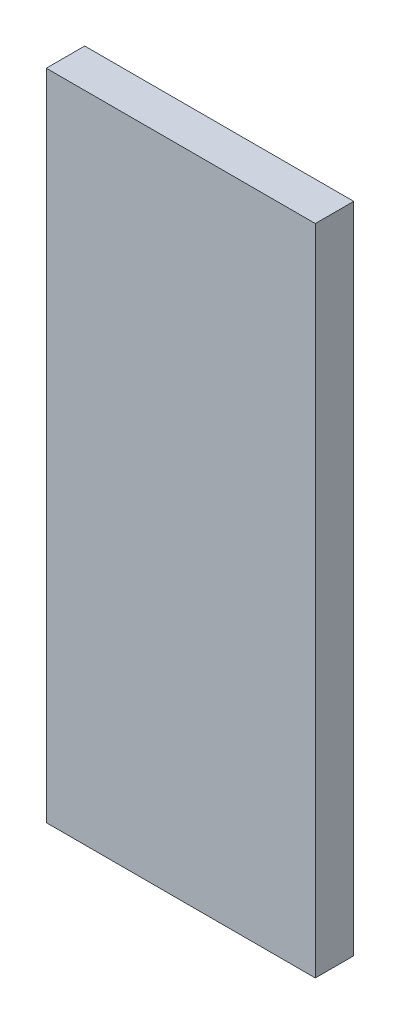
ISO-10303-21;
HEADER;
FILE_DESCRIPTION(('STEP AP214'),'2;1');
FILE_NAME('part.step','',(''),(''),'','','');
FILE_SCHEMA(('AUTOMOTIVE_DESIGN { 1 0 10303 214 1 1 1 1 }'));
ENDSEC;
DATA;
#1=APPLICATION_CONTEXT('core data for automotive mechanical design processes');
#2=APPLICATION_PROTOCOL_DEFINITION('international standard','automotive_design',2000,#1);
#3=PRODUCT_CONTEXT('',#1,'mechanical');
#4=PRODUCT('Part','Part','',(#3));
#5=PRODUCT_RELATED_PRODUCT_CATEGORY('part','',(#4));
#6=PRODUCT_DEFINITION_FORMATION('','',#4);
#7=PRODUCT_DEFINITION_CONTEXT('part definition',#1,'design');
#8=PRODUCT_DEFINITION('design','',#6,#7);
#9=PRODUCT_DEFINITION_SHAPE('','',#8);
#10=(LENGTH_UNIT() NAMED_UNIT(*) SI_UNIT(.MILLI.,.METRE.));
#11=(NAMED_UNIT(*) PLANE_ANGLE_UNIT() SI_UNIT($,.RADIAN.));
#12=(NAMED_UNIT(*) SI_UNIT($,.STERADIAN.) SOLID_ANGLE_UNIT());
#13=UNCERTAINTY_MEASURE_WITH_UNIT(LENGTH_MEASURE(1.E-05),#10,'distance_accuracy_value','');
#14=(GEOMETRIC_REPRESENTATION_CONTEXT(3) GLOBAL_UNCERTAINTY_ASSIGNED_CONTEXT((#13)) GLOBAL_UNIT_ASSIGNED_CONTEXT((#10,
#11,#12)) REPRESENTATION_CONTEXT('',''));
#15=CARTESIAN_POINT('',(0.,0.,0.));
#16=DIRECTION('',(0.,0.,1.));
#17=DIRECTION('',(1.,0.,0.));
#18=AXIS2_PLACEMENT_3D('',#15,#16,#17);
#19=CARTESIAN_POINT('',(0.,0.,50.));
#20=DIRECTION('',(1.,0.,0.));
#21=DIRECTION('',(0.,0.,-1.));
#22=AXIS2_PLACEMENT_3D('',#19,#20,#21);
#23=PLANE('',#22);
#24=DIRECTION('',(0.,-1.,0.));
#25=VECTOR('',#24,1.);
#26=CARTESIAN_POINT('',(0.,0.,0.));
#27=LINE('',#26,#25);
#28=CARTESIAN_POINT('',(0.,850.,0.));
#29=VERTEX_POINT('',#28);
#30=CARTESIAN_POINT('',(0.,0.,0.));
#31=VERTEX_POINT('',#30);
#32=EDGE_CURVE('E106',#29,#31,#27,.T.);
#33=ORIENTED_EDGE('',*,*,#32,.T.);
#34=DIRECTION('',(0.,0.,-1.));
#35=VECTOR('',#34,1.);
#36=CARTESIAN_POINT('',(0.,0.,50.));
#37=LINE('',#36,#35);
#38=CARTESIAN_POINT('',(0.,0.,50.));
#39=VERTEX_POINT('',#38);
#40=EDGE_CURVE('E11',#39,#31,#37,.T.);
#41=ORIENTED_EDGE('',*,*,#40,.F.);
#42=DIRECTION('',(0.,-1.,0.));
#43=VECTOR('',#42,1.);
#44=CARTESIAN_POINT('',(0.,0.,50.));
#45=LINE('',#44,#43);
#46=CARTESIAN_POINT('',(0.,850.,50.));
#47=VERTEX_POINT('',#46);
#48=EDGE_CURVE('E92',#47,#39,#45,.T.);
#49=ORIENTED_EDGE('',*,*,#48,.F.);
#50=DIRECTION('',(0.,0.,-1.));
#51=VECTOR('',#50,1.);
#52=CARTESIAN_POINT('',(0.,850.,50.));
#53=LINE('',#52,#51);
#54=EDGE_CURVE('E105',#47,#29,#53,.T.);
#55=ORIENTED_EDGE('',*,*,#54,.T.);
#56=EDGE_LOOP('',(#33,#41,#49,#55));
#57=FACE_BOUND('',#56,.T.);
#58=ADVANCED_FACE('F43',(#57),#23,.F.);
#59=CARTESIAN_POINT('',(0.,0.,50.));
#60=DIRECTION('',(0.,1.,0.));
#61=DIRECTION('',(0.,0.,1.));
#62=AXIS2_PLACEMENT_3D('',#59,#60,#61);
#63=PLANE('',#62);
#64=DIRECTION('',(1.,0.,0.));
#65=VECTOR('',#64,1.);
#66=CARTESIAN_POINT('',(0.,0.,0.));
#67=LINE('',#66,#65);
#68=CARTESIAN_POINT('',(350.,0.,0.));
#69=VERTEX_POINT('',#68);
#70=EDGE_CURVE('E97',#31,#69,#67,.T.);
#71=ORIENTED_EDGE('',*,*,#70,.T.);
#72=DIRECTION('',(0.,0.,-1.));
#73=VECTOR('',#72,1.);
#74=CARTESIAN_POINT('',(350.,0.,50.));
#75=LINE('',#74,#73);
#76=CARTESIAN_POINT('',(350.,0.,50.));
#77=VERTEX_POINT('',#76);
#78=EDGE_CURVE('E51',#77,#69,#75,.T.);
#79=ORIENTED_EDGE('',*,*,#78,.F.);
#80=DIRECTION('',(1.,0.,0.));
#81=VECTOR('',#80,1.);
#82=CARTESIAN_POINT('',(0.,0.,50.));
#83=LINE('',#82,#81);
#84=EDGE_CURVE('E87',#39,#77,#83,.T.);
#85=ORIENTED_EDGE('',*,*,#84,.F.);
#86=ORIENTED_EDGE('',*,*,#40,.T.);
#87=EDGE_LOOP('',(#71,#79,#85,#86));
#88=FACE_BOUND('',#87,.T.);
#89=ADVANCED_FACE('F100',(#88),#63,.F.);
#90=CARTESIAN_POINT('',(350.,0.,50.));
#91=DIRECTION('',(-1.,0.,0.));
#92=DIRECTION('',(0.,0.,1.));
#93=AXIS2_PLACEMENT_3D('',#90,#91,#92);
#94=PLANE('',#93);
#95=DIRECTION('',(0.,1.,0.));
#96=VECTOR('',#95,1.);
#97=CARTESIAN_POINT('',(350.,0.,0.));
#98=LINE('',#97,#96);
#99=CARTESIAN_POINT('',(350.,850.,0.));
#100=VERTEX_POINT('',#99);
#101=EDGE_CURVE('E78',#69,#100,#98,.T.);
#102=ORIENTED_EDGE('',*,*,#101,.T.);
#103=DIRECTION('',(0.,0.,-1.));
#104=VECTOR('',#103,1.);
#105=CARTESIAN_POINT('',(350.,850.,50.));
#106=LINE('',#105,#104);
#107=CARTESIAN_POINT('',(350.,850.,50.));
#108=VERTEX_POINT('',#107);
#109=EDGE_CURVE('E98',#108,#100,#106,.T.);
#110=ORIENTED_EDGE('',*,*,#109,.F.);
#111=DIRECTION('',(0.,1.,0.));
#112=VECTOR('',#111,1.);
#113=CARTESIAN_POINT('',(350.,0.,50.));
#114=LINE('',#113,#112);
#115=EDGE_CURVE('E95',#77,#108,#114,.T.);
#116=ORIENTED_EDGE('',*,*,#115,.F.);
#117=ORIENTED_EDGE('',*,*,#78,.T.);
#118=EDGE_LOOP('',(#102,#110,#116,#117));
#119=FACE_BOUND('',#118,.T.);
#120=ADVANCED_FACE('F99',(#119),#94,.F.);
#121=CARTESIAN_POINT('',(0.,850.,50.));
#122=DIRECTION('',(0.,-1.,0.));
#123=DIRECTION('',(0.,0.,-1.));
#124=AXIS2_PLACEMENT_3D('',#121,#122,#123);
#125=PLANE('',#124);
#126=DIRECTION('',(-1.,0.,0.));
#127=VECTOR('',#126,1.);
#128=CARTESIAN_POINT('',(0.,850.,0.));
#129=LINE('',#128,#127);
#130=EDGE_CURVE('E85',#100,#29,#129,.T.);
#131=ORIENTED_EDGE('',*,*,#130,.T.);
#132=ORIENTED_EDGE('',*,*,#54,.F.);
#133=DIRECTION('',(-1.,0.,0.));
#134=VECTOR('',#133,1.);
#135=CARTESIAN_POINT('',(0.,850.,50.));
#136=LINE('',#135,#134);
#137=EDGE_CURVE('E56',#108,#47,#136,.T.);
#138=ORIENTED_EDGE('',*,*,#137,.F.);
#139=ORIENTED_EDGE('',*,*,#109,.T.);
#140=EDGE_LOOP('',(#131,#132,#138,#139));
#141=FACE_BOUND('',#140,.T.);
#142=ADVANCED_FACE('F111',(#141),#125,.F.);
#143=CARTESIAN_POINT('',(0.,0.,50.));
#144=DIRECTION('',(0.,0.,-1.));
#145=DIRECTION('',(-1.,0.,0.));
#146=AXIS2_PLACEMENT_3D('',#143,#144,#145);
#147=PLANE('',#146);
#148=ORIENTED_EDGE('',*,*,#48,.T.);
#149=ORIENTED_EDGE('',*,*,#84,.T.);
#150=ORIENTED_EDGE('',*,*,#115,.T.);
#151=ORIENTED_EDGE('',*,*,#137,.T.);
#152=EDGE_LOOP('',(#148,#149,#150,#151));
#153=FACE_BOUND('',#152,.T.);
#154=ADVANCED_FACE('F89',(#153),#147,.F.);
#155=CARTESIAN_POINT('',(0.,0.,0.));
#156=DIRECTION('',(0.,0.,-1.));
#157=DIRECTION('',(-1.,0.,0.));
#158=AXIS2_PLACEMENT_3D('',#155,#156,#157);
#159=PLANE('',#158);
#160=ORIENTED_EDGE('',*,*,#32,.F.);
#161=ORIENTED_EDGE('',*,*,#130,.F.);
#162=ORIENTED_EDGE('',*,*,#101,.F.);
#163=ORIENTED_EDGE('',*,*,#70,.F.);
#164=EDGE_LOOP('',(#160,#161,#162,#163));
#165=FACE_BOUND('',#164,.T.);
#166=ADVANCED_FACE('F116',(#165),#159,.T.);
#167=CLOSED_SHELL('',(#58,#89,#120,#142,#154,#166));
#168=MANIFOLD_SOLID_BREP('B2',#167);
#169=ADVANCED_BREP_SHAPE_REPRESENTATION('',(#18,#168),#14);
#170=SHAPE_DEFINITION_REPRESENTATION(#9,#169);
ENDSEC;
END-ISO-10303-21;
